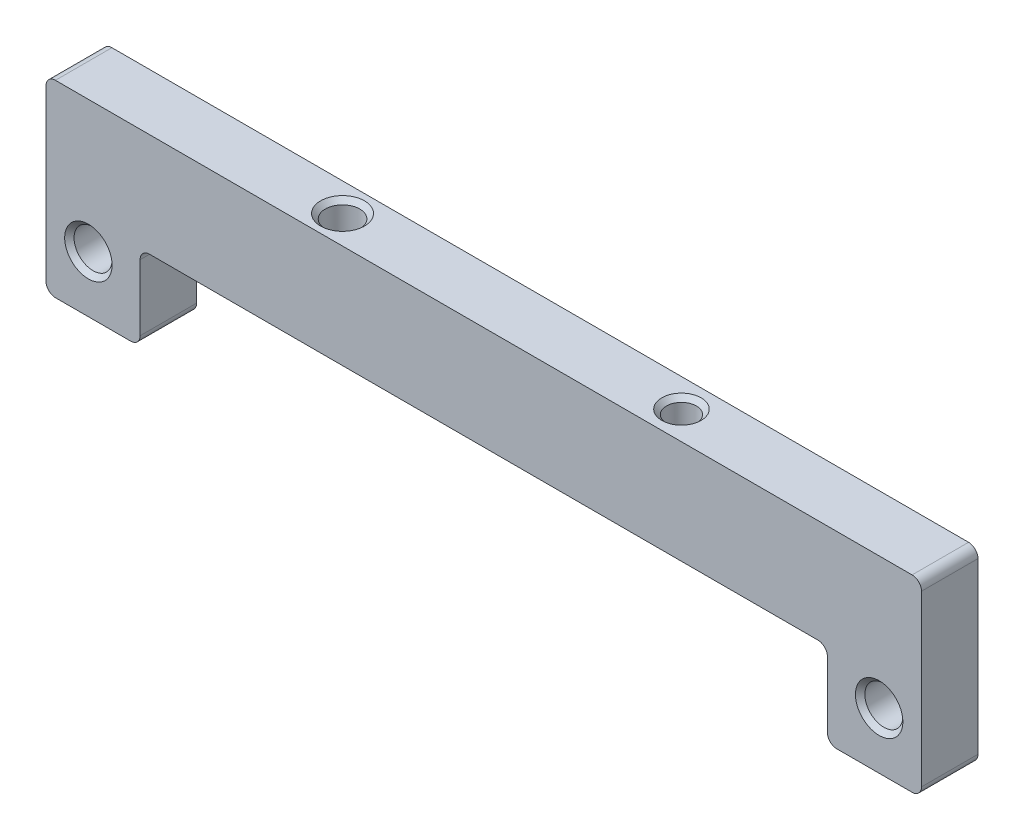
ISO-10303-21;
HEADER;
FILE_DESCRIPTION(('STEP AP214'),'2;1');
FILE_NAME('part.step','',(''),(''),'','','');
FILE_SCHEMA(('AUTOMOTIVE_DESIGN { 1 0 10303 214 1 1 1 1 }'));
ENDSEC;
DATA;
#1=APPLICATION_CONTEXT('core data for automotive mechanical design processes');
#2=APPLICATION_PROTOCOL_DEFINITION('international standard','automotive_design',2000,#1);
#3=PRODUCT_CONTEXT('',#1,'mechanical');
#4=PRODUCT('Part','Part','',(#3));
#5=PRODUCT_RELATED_PRODUCT_CATEGORY('part','',(#4));
#6=PRODUCT_DEFINITION_FORMATION('','',#4);
#7=PRODUCT_DEFINITION_CONTEXT('part definition',#1,'design');
#8=PRODUCT_DEFINITION('design','',#6,#7);
#9=PRODUCT_DEFINITION_SHAPE('','',#8);
#10=(LENGTH_UNIT() NAMED_UNIT(*) SI_UNIT(.MILLI.,.METRE.));
#11=(NAMED_UNIT(*) PLANE_ANGLE_UNIT() SI_UNIT($,.RADIAN.));
#12=(NAMED_UNIT(*) SI_UNIT($,.STERADIAN.) SOLID_ANGLE_UNIT());
#13=UNCERTAINTY_MEASURE_WITH_UNIT(LENGTH_MEASURE(1.E-05),#10,'distance_accuracy_value','');
#14=(GEOMETRIC_REPRESENTATION_CONTEXT(3) GLOBAL_UNCERTAINTY_ASSIGNED_CONTEXT((#13)) GLOBAL_UNIT_ASSIGNED_CONTEXT((#10,
#11,#12)) REPRESENTATION_CONTEXT('',''));
#15=CARTESIAN_POINT('',(0.,0.,0.));
#16=DIRECTION('',(0.,0.,1.));
#17=DIRECTION('',(1.,0.,0.));
#18=AXIS2_PLACEMENT_3D('',#15,#16,#17);
#19=CARTESIAN_POINT('',(-46.5,-10.,6.));
#20=DIRECTION('',(0.,1.,0.));
#21=DIRECTION('',(0.,0.,1.));
#22=AXIS2_PLACEMENT_3D('',#19,#20,#21);
#23=PLANE('',#22);
#24=DIRECTION('',(1.,0.,0.));
#25=VECTOR('',#24,1.);
#26=CARTESIAN_POINT('',(-46.5,-10.,6.));
#27=LINE('',#26,#25);
#28=CARTESIAN_POINT('',(-45.5,-10.,6.));
#29=VERTEX_POINT('',#28);
#30=CARTESIAN_POINT('',(-37.5,-10.,6.));
#31=VERTEX_POINT('',#30);
#32=EDGE_CURVE('E175',#29,#31,#27,.T.);
#33=ORIENTED_EDGE('',*,*,#32,.F.);
#34=DIRECTION('',(0.,0.,-1.));
#35=VECTOR('',#34,1.);
#36=CARTESIAN_POINT('',(-45.5,-10.,6.));
#37=LINE('',#36,#35);
#38=CARTESIAN_POINT('',(-45.5,-10.,0.));
#39=VERTEX_POINT('',#38);
#40=EDGE_CURVE('E158',#29,#39,#37,.T.);
#41=ORIENTED_EDGE('',*,*,#40,.T.);
#42=DIRECTION('',(1.,0.,0.));
#43=VECTOR('',#42,1.);
#44=CARTESIAN_POINT('',(-46.5,-10.,0.));
#45=LINE('',#44,#43);
#46=CARTESIAN_POINT('',(-37.5,-10.,0.));
#47=VERTEX_POINT('',#46);
#48=EDGE_CURVE('E172',#39,#47,#45,.T.);
#49=ORIENTED_EDGE('',*,*,#48,.T.);
#50=DIRECTION('',(0.,0.,1.));
#51=VECTOR('',#50,1.);
#52=CARTESIAN_POINT('',(-37.5,-10.,6.));
#53=LINE('',#52,#51);
#54=EDGE_CURVE('E178',#47,#31,#53,.T.);
#55=ORIENTED_EDGE('',*,*,#54,.T.);
#56=EDGE_LOOP('',(#33,#41,#49,#55));
#57=FACE_BOUND('',#56,.T.);
#58=ADVANCED_FACE('F38',(#57),#23,.F.);
#59=CARTESIAN_POINT('',(46.5,-10.,6.));
#60=DIRECTION('',(-1.,0.,0.));
#61=DIRECTION('',(0.,0.,1.));
#62=AXIS2_PLACEMENT_3D('',#59,#60,#61);
#63=PLANE('',#62);
#64=DIRECTION('',(0.,1.,0.));
#65=VECTOR('',#64,1.);
#66=CARTESIAN_POINT('',(46.5,-10.,6.));
#67=LINE('',#66,#65);
#68=CARTESIAN_POINT('',(46.5,-9.,6.));
#69=VERTEX_POINT('',#68);
#70=CARTESIAN_POINT('',(46.5,9.,6.));
#71=VERTEX_POINT('',#70);
#72=EDGE_CURVE('E185',#69,#71,#67,.T.);
#73=ORIENTED_EDGE('',*,*,#72,.F.);
#74=DIRECTION('',(0.,0.,-1.));
#75=VECTOR('',#74,1.);
#76=CARTESIAN_POINT('',(46.5,-9.,6.));
#77=LINE('',#76,#75);
#78=CARTESIAN_POINT('',(46.5,-9.,0.));
#79=VERTEX_POINT('',#78);
#80=EDGE_CURVE('E242',#69,#79,#77,.T.);
#81=ORIENTED_EDGE('',*,*,#80,.T.);
#82=DIRECTION('',(0.,1.,0.));
#83=VECTOR('',#82,1.);
#84=CARTESIAN_POINT('',(46.5,-10.,0.));
#85=LINE('',#84,#83);
#86=CARTESIAN_POINT('',(46.5,9.,0.));
#87=VERTEX_POINT('',#86);
#88=EDGE_CURVE('E361',#79,#87,#85,.T.);
#89=ORIENTED_EDGE('',*,*,#88,.T.);
#90=DIRECTION('',(0.,0.,-1.));
#91=VECTOR('',#90,1.);
#92=CARTESIAN_POINT('',(46.5,9.,6.));
#93=LINE('',#92,#91);
#94=EDGE_CURVE('E239',#87,#71,#93,.F.);
#95=ORIENTED_EDGE('',*,*,#94,.T.);
#96=EDGE_LOOP('',(#73,#81,#89,#95));
#97=FACE_BOUND('',#96,.T.);
#98=ADVANCED_FACE('F354',(#97),#63,.F.);
#99=CARTESIAN_POINT('',(-46.5,10.,6.));
#100=DIRECTION('',(0.,-1.,0.));
#101=DIRECTION('',(0.,0.,-1.));
#102=AXIS2_PLACEMENT_3D('',#99,#100,#101);
#103=PLANE('',#102);
#104=CARTESIAN_POINT('',(-18.,10.,3.));
#105=DIRECTION('',(0.,-1.,0.));
#106=DIRECTION('',(0.,0.,-1.));
#107=AXIS2_PLACEMENT_3D('',#104,#105,#106);
#108=CIRCLE('',#107,2.32880000000001);
#109=CARTESIAN_POINT('',(-18.,10.,0.671199999999993));
#110=VERTEX_POINT('',#109);
#111=EDGE_CURVE('E337',#110,#110,#108,.T.);
#112=ORIENTED_EDGE('',*,*,#111,.T.);
#113=EDGE_LOOP('',(#112));
#114=FACE_BOUND('',#113,.T.);
#115=CARTESIAN_POINT('',(18.,10.,3.));
#116=DIRECTION('',(0.,-1.,0.));
#117=DIRECTION('',(0.,0.,-1.));
#118=AXIS2_PLACEMENT_3D('',#115,#116,#117);
#119=CIRCLE('',#118,2.08749999999999);
#120=CARTESIAN_POINT('',(18.,10.,0.912500000000007));
#121=VERTEX_POINT('',#120);
#122=EDGE_CURVE('E333',#121,#121,#119,.T.);
#123=ORIENTED_EDGE('',*,*,#122,.T.);
#124=EDGE_LOOP('',(#123));
#125=FACE_BOUND('',#124,.T.);
#126=DIRECTION('',(-1.,0.,0.));
#127=VECTOR('',#126,1.);
#128=CARTESIAN_POINT('',(-46.5,10.,0.));
#129=LINE('',#128,#127);
#130=CARTESIAN_POINT('',(45.5,10.,0.));
#131=VERTEX_POINT('',#130);
#132=CARTESIAN_POINT('',(-45.5,10.,0.));
#133=VERTEX_POINT('',#132);
#134=EDGE_CURVE('E358',#131,#133,#129,.T.);
#135=ORIENTED_EDGE('',*,*,#134,.T.);
#136=DIRECTION('',(0.,0.,-1.));
#137=VECTOR('',#136,1.);
#138=CARTESIAN_POINT('',(-45.5,10.,6.));
#139=LINE('',#138,#137);
#140=CARTESIAN_POINT('',(-45.5,10.,6.));
#141=VERTEX_POINT('',#140);
#142=EDGE_CURVE('E54',#133,#141,#139,.F.);
#143=ORIENTED_EDGE('',*,*,#142,.T.);
#144=DIRECTION('',(-1.,0.,0.));
#145=VECTOR('',#144,1.);
#146=CARTESIAN_POINT('',(-46.5,10.,6.));
#147=LINE('',#146,#145);
#148=CARTESIAN_POINT('',(45.5,10.,6.));
#149=VERTEX_POINT('',#148);
#150=EDGE_CURVE('E190',#149,#141,#147,.T.);
#151=ORIENTED_EDGE('',*,*,#150,.F.);
#152=DIRECTION('',(0.,0.,-1.));
#153=VECTOR('',#152,1.);
#154=CARTESIAN_POINT('',(45.5,10.,6.));
#155=LINE('',#154,#153);
#156=EDGE_CURVE('E233',#149,#131,#155,.T.);
#157=ORIENTED_EDGE('',*,*,#156,.T.);
#158=EDGE_LOOP('',(#135,#143,#151,#157));
#159=FACE_BOUND('',#158,.T.);
#160=ADVANCED_FACE('F351',(#114,#125,#159),#103,.F.);
#161=CARTESIAN_POINT('',(-46.5,-10.,6.));
#162=DIRECTION('',(1.,0.,0.));
#163=DIRECTION('',(0.,0.,-1.));
#164=AXIS2_PLACEMENT_3D('',#161,#162,#163);
#165=PLANE('',#164);
#166=DIRECTION('',(0.,-1.,0.));
#167=VECTOR('',#166,1.);
#168=CARTESIAN_POINT('',(-46.5,-10.,0.));
#169=LINE('',#168,#167);
#170=CARTESIAN_POINT('',(-46.5,9.,0.));
#171=VERTEX_POINT('',#170);
#172=CARTESIAN_POINT('',(-46.5,-9.,0.));
#173=VERTEX_POINT('',#172);
#174=EDGE_CURVE('E193',#171,#173,#169,.T.);
#175=ORIENTED_EDGE('',*,*,#174,.T.);
#176=DIRECTION('',(0.,0.,-1.));
#177=VECTOR('',#176,1.);
#178=CARTESIAN_POINT('',(-46.5,-9.,6.));
#179=LINE('',#178,#177);
#180=CARTESIAN_POINT('',(-46.5,-9.,6.));
#181=VERTEX_POINT('',#180);
#182=EDGE_CURVE('E159',#173,#181,#179,.F.);
#183=ORIENTED_EDGE('',*,*,#182,.T.);
#184=DIRECTION('',(0.,-1.,0.));
#185=VECTOR('',#184,1.);
#186=CARTESIAN_POINT('',(-46.5,-10.,6.));
#187=LINE('',#186,#185);
#188=CARTESIAN_POINT('',(-46.5,9.,6.));
#189=VERTEX_POINT('',#188);
#190=EDGE_CURVE('E369',#189,#181,#187,.T.);
#191=ORIENTED_EDGE('',*,*,#190,.F.);
#192=DIRECTION('',(0.,0.,-1.));
#193=VECTOR('',#192,1.);
#194=CARTESIAN_POINT('',(-46.5,9.,6.));
#195=LINE('',#194,#193);
#196=EDGE_CURVE('E165',#189,#171,#195,.T.);
#197=ORIENTED_EDGE('',*,*,#196,.T.);
#198=EDGE_LOOP('',(#175,#183,#191,#197));
#199=FACE_BOUND('',#198,.T.);
#200=ADVANCED_FACE('F353',(#199),#165,.F.);
#201=CARTESIAN_POINT('',(37.5,-10.,0.));
#202=VERTEX_POINT('',#201);
#203=CARTESIAN_POINT('',(45.5,-10.,0.));
#204=VERTEX_POINT('',#203);
#205=EDGE_CURVE('E186',#202,#204,#45,.T.);
#206=ORIENTED_EDGE('',*,*,#205,.T.);
#207=DIRECTION('',(0.,0.,-1.));
#208=VECTOR('',#207,1.);
#209=CARTESIAN_POINT('',(45.5,-10.,6.));
#210=LINE('',#209,#208);
#211=CARTESIAN_POINT('',(45.5,-10.,6.));
#212=VERTEX_POINT('',#211);
#213=EDGE_CURVE('E249',#204,#212,#210,.F.);
#214=ORIENTED_EDGE('',*,*,#213,.T.);
#215=CARTESIAN_POINT('',(37.5,-10.,6.));
#216=VERTEX_POINT('',#215);
#217=EDGE_CURVE('E372',#216,#212,#27,.T.);
#218=ORIENTED_EDGE('',*,*,#217,.F.);
#219=DIRECTION('',(0.,0.,1.));
#220=VECTOR('',#219,1.);
#221=CARTESIAN_POINT('',(37.5,-10.,6.));
#222=LINE('',#221,#220);
#223=EDGE_CURVE('E246',#216,#202,#222,.F.);
#224=ORIENTED_EDGE('',*,*,#223,.T.);
#225=EDGE_LOOP('',(#206,#214,#218,#224));
#226=FACE_BOUND('',#225,.T.);
#227=ADVANCED_FACE('F449',(#226),#23,.F.);
#228=CARTESIAN_POINT('',(0.,0.,6.));
#229=DIRECTION('',(0.,0.,-1.));
#230=DIRECTION('',(-1.,0.,0.));
#231=AXIS2_PLACEMENT_3D('',#228,#229,#230);
#232=PLANE('',#231);
#233=CARTESIAN_POINT('',(42.,-3.99999999999999,6.));
#234=DIRECTION('',(0.,0.,-1.));
#235=DIRECTION('',(-1.,0.,0.));
#236=AXIS2_PLACEMENT_3D('',#233,#234,#235);
#237=CIRCLE('',#236,2.51930000000004);
#238=CARTESIAN_POINT('',(39.4807,-3.99999999999999,6.));
#239=VERTEX_POINT('',#238);
#240=EDGE_CURVE('E297',#239,#239,#237,.T.);
#241=ORIENTED_EDGE('',*,*,#240,.T.);
#242=EDGE_LOOP('',(#241));
#243=FACE_BOUND('',#242,.T.);
#244=CARTESIAN_POINT('',(-42.,-4.,6.));
#245=DIRECTION('',(0.,0.,-1.));
#246=DIRECTION('',(-1.,0.,0.));
#247=AXIS2_PLACEMENT_3D('',#244,#245,#246);
#248=CIRCLE('',#247,2.51930000000002);
#249=CARTESIAN_POINT('',(-44.5193,-4.,6.));
#250=VERTEX_POINT('',#249);
#251=EDGE_CURVE('E293',#250,#250,#248,.T.);
#252=ORIENTED_EDGE('',*,*,#251,.T.);
#253=EDGE_LOOP('',(#252));
#254=FACE_BOUND('',#253,.T.);
#255=ORIENTED_EDGE('',*,*,#190,.T.);
#256=CARTESIAN_POINT('',(-45.5,-9.,6.));
#257=DIRECTION('',(0.,0.,-1.));
#258=DIRECTION('',(-1.,0.,0.));
#259=AXIS2_PLACEMENT_3D('',#256,#257,#258);
#260=CIRCLE('',#259,1.);
#261=EDGE_CURVE('E230',#181,#29,#260,.F.);
#262=ORIENTED_EDGE('',*,*,#261,.T.);
#263=ORIENTED_EDGE('',*,*,#32,.T.);
#264=CARTESIAN_POINT('',(-37.5,-9.,6.));
#265=DIRECTION('',(0.,0.,-1.));
#266=DIRECTION('',(-1.,0.,0.));
#267=AXIS2_PLACEMENT_3D('',#264,#265,#266);
#268=CIRCLE('',#267,1.);
#269=CARTESIAN_POINT('',(-36.5,-9.,6.));
#270=VERTEX_POINT('',#269);
#271=EDGE_CURVE('E218',#31,#270,#268,.F.);
#272=ORIENTED_EDGE('',*,*,#271,.T.);
#273=DIRECTION('',(0.,-1.,0.));
#274=VECTOR('',#273,1.);
#275=CARTESIAN_POINT('',(-36.5,-10.,6.));
#276=LINE('',#275,#274);
#277=CARTESIAN_POINT('',(-36.5,-2.,6.));
#278=VERTEX_POINT('',#277);
#279=EDGE_CURVE('E395',#278,#270,#276,.T.);
#280=ORIENTED_EDGE('',*,*,#279,.F.);
#281=CARTESIAN_POINT('',(-35.5,-2.,6.));
#282=DIRECTION('',(0.,0.,-1.));
#283=DIRECTION('',(-1.,0.,0.));
#284=AXIS2_PLACEMENT_3D('',#281,#282,#283);
#285=CIRCLE('',#284,1.);
#286=CARTESIAN_POINT('',(-35.5,-1.,6.));
#287=VERTEX_POINT('',#286);
#288=EDGE_CURVE('E279',#278,#287,#285,.T.);
#289=ORIENTED_EDGE('',*,*,#288,.T.);
#290=DIRECTION('',(-1.,0.,0.));
#291=VECTOR('',#290,1.);
#292=CARTESIAN_POINT('',(-36.5,-1.,6.));
#293=LINE('',#292,#291);
#294=CARTESIAN_POINT('',(35.5,-1.,6.));
#295=VERTEX_POINT('',#294);
#296=EDGE_CURVE('E382',#295,#287,#293,.T.);
#297=ORIENTED_EDGE('',*,*,#296,.F.);
#298=CARTESIAN_POINT('',(35.5,-2.,6.));
#299=DIRECTION('',(0.,0.,-1.));
#300=DIRECTION('',(-1.,0.,0.));
#301=AXIS2_PLACEMENT_3D('',#298,#299,#300);
#302=CIRCLE('',#301,1.);
#303=CARTESIAN_POINT('',(36.5,-2.,6.));
#304=VERTEX_POINT('',#303);
#305=EDGE_CURVE('E273',#295,#304,#302,.T.);
#306=ORIENTED_EDGE('',*,*,#305,.T.);
#307=DIRECTION('',(0.,1.,0.));
#308=VECTOR('',#307,1.);
#309=CARTESIAN_POINT('',(36.5,-10.,6.));
#310=LINE('',#309,#308);
#311=CARTESIAN_POINT('',(36.5,-9.,6.));
#312=VERTEX_POINT('',#311);
#313=EDGE_CURVE('E388',#312,#304,#310,.T.);
#314=ORIENTED_EDGE('',*,*,#313,.F.);
#315=CARTESIAN_POINT('',(37.5,-9.,6.));
#316=DIRECTION('',(0.,0.,-1.));
#317=DIRECTION('',(-1.,0.,0.));
#318=AXIS2_PLACEMENT_3D('',#315,#316,#317);
#319=CIRCLE('',#318,1.);
#320=EDGE_CURVE('E221',#312,#216,#319,.F.);
#321=ORIENTED_EDGE('',*,*,#320,.T.);
#322=ORIENTED_EDGE('',*,*,#217,.T.);
#323=CARTESIAN_POINT('',(45.5,-9.,6.));
#324=DIRECTION('',(0.,0.,-1.));
#325=DIRECTION('',(-1.,0.,0.));
#326=AXIS2_PLACEMENT_3D('',#323,#324,#325);
#327=CIRCLE('',#326,1.);
#328=EDGE_CURVE('E224',#212,#69,#327,.F.);
#329=ORIENTED_EDGE('',*,*,#328,.T.);
#330=ORIENTED_EDGE('',*,*,#72,.T.);
#331=CARTESIAN_POINT('',(45.5,9.,6.));
#332=DIRECTION('',(0.,0.,-1.));
#333=DIRECTION('',(-1.,0.,0.));
#334=AXIS2_PLACEMENT_3D('',#331,#332,#333);
#335=CIRCLE('',#334,1.);
#336=EDGE_CURVE('E61',#71,#149,#335,.F.);
#337=ORIENTED_EDGE('',*,*,#336,.T.);
#338=ORIENTED_EDGE('',*,*,#150,.T.);
#339=CARTESIAN_POINT('',(-45.5,9.,6.));
#340=DIRECTION('',(0.,0.,-1.));
#341=DIRECTION('',(-1.,0.,0.));
#342=AXIS2_PLACEMENT_3D('',#339,#340,#341);
#343=CIRCLE('',#342,1.);
#344=EDGE_CURVE('E227',#141,#189,#343,.F.);
#345=ORIENTED_EDGE('',*,*,#344,.T.);
#346=EDGE_LOOP('',(#255,#262,#263,#272,#280,#289,#297,#306,#314,#321,#322,#329,#330,#337,#338,#345));
#347=FACE_BOUND('',#346,.T.);
#348=ADVANCED_FACE('F368',(#243,#254,#347),#232,.F.);
#349=CARTESIAN_POINT('',(0.,0.,0.));
#350=DIRECTION('',(0.,0.,-1.));
#351=DIRECTION('',(-1.,0.,0.));
#352=AXIS2_PLACEMENT_3D('',#349,#350,#351);
#353=PLANE('',#352);
#354=CARTESIAN_POINT('',(42.,-3.99999999999999,0.));
#355=DIRECTION('',(0.,0.,-1.));
#356=DIRECTION('',(-1.,0.,0.));
#357=AXIS2_PLACEMENT_3D('',#354,#355,#356);
#358=CIRCLE('',#357,2.51930000000001);
#359=CARTESIAN_POINT('',(39.4807,-3.99999999999999,0.));
#360=VERTEX_POINT('',#359);
#361=EDGE_CURVE('E305',#360,#360,#358,.F.);
#362=ORIENTED_EDGE('',*,*,#361,.T.);
#363=EDGE_LOOP('',(#362));
#364=FACE_BOUND('',#363,.T.);
#365=CARTESIAN_POINT('',(-42.,-4.,0.));
#366=DIRECTION('',(0.,0.,-1.));
#367=DIRECTION('',(-1.,0.,0.));
#368=AXIS2_PLACEMENT_3D('',#365,#366,#367);
#369=CIRCLE('',#368,2.51930000000001);
#370=CARTESIAN_POINT('',(-44.5193,-4.,0.));
#371=VERTEX_POINT('',#370);
#372=EDGE_CURVE('E301',#371,#371,#369,.F.);
#373=ORIENTED_EDGE('',*,*,#372,.T.);
#374=EDGE_LOOP('',(#373));
#375=FACE_BOUND('',#374,.T.);
#376=ORIENTED_EDGE('',*,*,#48,.F.);
#377=CARTESIAN_POINT('',(-45.5,-9.,0.));
#378=DIRECTION('',(0.,0.,-1.));
#379=DIRECTION('',(-1.,0.,0.));
#380=AXIS2_PLACEMENT_3D('',#377,#378,#379);
#381=CIRCLE('',#380,1.);
#382=EDGE_CURVE('E154',#39,#173,#381,.T.);
#383=ORIENTED_EDGE('',*,*,#382,.T.);
#384=ORIENTED_EDGE('',*,*,#174,.F.);
#385=CARTESIAN_POINT('',(-45.5,9.,0.));
#386=DIRECTION('',(0.,0.,-1.));
#387=DIRECTION('',(-1.,0.,0.));
#388=AXIS2_PLACEMENT_3D('',#385,#386,#387);
#389=CIRCLE('',#388,1.);
#390=EDGE_CURVE('E166',#171,#133,#389,.T.);
#391=ORIENTED_EDGE('',*,*,#390,.T.);
#392=ORIENTED_EDGE('',*,*,#134,.F.);
#393=CARTESIAN_POINT('',(45.5,9.,0.));
#394=DIRECTION('',(0.,0.,-1.));
#395=DIRECTION('',(-1.,0.,0.));
#396=AXIS2_PLACEMENT_3D('',#393,#394,#395);
#397=CIRCLE('',#396,1.);
#398=EDGE_CURVE('E177',#131,#87,#397,.T.);
#399=ORIENTED_EDGE('',*,*,#398,.T.);
#400=ORIENTED_EDGE('',*,*,#88,.F.);
#401=CARTESIAN_POINT('',(45.5,-9.,0.));
#402=DIRECTION('',(0.,0.,-1.));
#403=DIRECTION('',(-1.,0.,0.));
#404=AXIS2_PLACEMENT_3D('',#401,#402,#403);
#405=CIRCLE('',#404,1.);
#406=EDGE_CURVE('E206',#79,#204,#405,.T.);
#407=ORIENTED_EDGE('',*,*,#406,.T.);
#408=ORIENTED_EDGE('',*,*,#205,.F.);
#409=CARTESIAN_POINT('',(37.5,-9.,0.));
#410=DIRECTION('',(0.,0.,-1.));
#411=DIRECTION('',(-1.,0.,0.));
#412=AXIS2_PLACEMENT_3D('',#409,#410,#411);
#413=CIRCLE('',#412,1.);
#414=CARTESIAN_POINT('',(36.5,-9.,0.));
#415=VERTEX_POINT('',#414);
#416=EDGE_CURVE('E203',#202,#415,#413,.T.);
#417=ORIENTED_EDGE('',*,*,#416,.T.);
#418=DIRECTION('',(0.,1.,0.));
#419=VECTOR('',#418,1.);
#420=CARTESIAN_POINT('',(36.5,-10.,0.));
#421=LINE('',#420,#419);
#422=CARTESIAN_POINT('',(36.5,-2.,0.));
#423=VERTEX_POINT('',#422);
#424=EDGE_CURVE('E408',#415,#423,#421,.T.);
#425=ORIENTED_EDGE('',*,*,#424,.T.);
#426=CARTESIAN_POINT('',(35.5,-2.,0.));
#427=DIRECTION('',(0.,0.,-1.));
#428=DIRECTION('',(-1.,0.,0.));
#429=AXIS2_PLACEMENT_3D('',#426,#427,#428);
#430=CIRCLE('',#429,1.);
#431=CARTESIAN_POINT('',(35.5,-1.,0.));
#432=VERTEX_POINT('',#431);
#433=EDGE_CURVE('E276',#423,#432,#430,.F.);
#434=ORIENTED_EDGE('',*,*,#433,.T.);
#435=DIRECTION('',(-1.,0.,0.));
#436=VECTOR('',#435,1.);
#437=CARTESIAN_POINT('',(-36.5,-1.,0.));
#438=LINE('',#437,#436);
#439=CARTESIAN_POINT('',(-35.5,-1.,0.));
#440=VERTEX_POINT('',#439);
#441=EDGE_CURVE('E404',#432,#440,#438,.T.);
#442=ORIENTED_EDGE('',*,*,#441,.T.);
#443=CARTESIAN_POINT('',(-35.5,-2.,0.));
#444=DIRECTION('',(0.,0.,-1.));
#445=DIRECTION('',(-1.,0.,0.));
#446=AXIS2_PLACEMENT_3D('',#443,#444,#445);
#447=CIRCLE('',#446,1.);
#448=CARTESIAN_POINT('',(-36.5,-2.,0.));
#449=VERTEX_POINT('',#448);
#450=EDGE_CURVE('E282',#440,#449,#447,.F.);
#451=ORIENTED_EDGE('',*,*,#450,.T.);
#452=DIRECTION('',(0.,-1.,0.));
#453=VECTOR('',#452,1.);
#454=CARTESIAN_POINT('',(-36.5,-10.,0.));
#455=LINE('',#454,#453);
#456=CARTESIAN_POINT('',(-36.5,-9.,0.));
#457=VERTEX_POINT('',#456);
#458=EDGE_CURVE('E401',#449,#457,#455,.T.);
#459=ORIENTED_EDGE('',*,*,#458,.T.);
#460=CARTESIAN_POINT('',(-37.5,-9.,0.));
#461=DIRECTION('',(0.,0.,-1.));
#462=DIRECTION('',(-1.,0.,0.));
#463=AXIS2_PLACEMENT_3D('',#460,#461,#462);
#464=CIRCLE('',#463,1.);
#465=EDGE_CURVE('E183',#457,#47,#464,.T.);
#466=ORIENTED_EDGE('',*,*,#465,.T.);
#467=EDGE_LOOP('',(#376,#383,#384,#391,#392,#399,#400,#407,#408,#417,#425,#434,#442,#451,#459,#466));
#468=FACE_BOUND('',#467,.T.);
#469=ADVANCED_FACE('F180',(#364,#375,#468),#353,.T.);
#470=CARTESIAN_POINT('',(-36.5,-10.,-0.00100000000000013));
#471=DIRECTION('',(-1.,0.,0.));
#472=DIRECTION('',(0.,-1.,0.));
#473=AXIS2_PLACEMENT_3D('',#470,#471,#472);
#474=PLANE('',#473);
#475=ORIENTED_EDGE('',*,*,#458,.F.);
#476=DIRECTION('',(0.,0.,1.));
#477=VECTOR('',#476,1.);
#478=CARTESIAN_POINT('',(-36.5,-2.,6.));
#479=LINE('',#478,#477);
#480=EDGE_CURVE('E269',#449,#278,#479,.T.);
#481=ORIENTED_EDGE('',*,*,#480,.T.);
#482=ORIENTED_EDGE('',*,*,#279,.T.);
#483=DIRECTION('',(0.,0.,1.));
#484=VECTOR('',#483,1.);
#485=CARTESIAN_POINT('',(-36.5,-9.,-0.00100000000000013));
#486=LINE('',#485,#484);
#487=EDGE_CURVE('E266',#270,#457,#486,.F.);
#488=ORIENTED_EDGE('',*,*,#487,.T.);
#489=EDGE_LOOP('',(#475,#481,#482,#488));
#490=FACE_BOUND('',#489,.T.);
#491=ADVANCED_FACE('F431',(#490),#474,.F.);
#492=CARTESIAN_POINT('',(-36.5,-1.,-0.00100000000000013));
#493=DIRECTION('',(0.,1.,0.));
#494=DIRECTION('',(0.,0.,1.));
#495=AXIS2_PLACEMENT_3D('',#492,#493,#494);
#496=PLANE('',#495);
#497=CARTESIAN_POINT('',(-18.,-1.,3.));
#498=DIRECTION('',(0.,1.,0.));
#499=DIRECTION('',(0.,0.,1.));
#500=AXIS2_PLACEMENT_3D('',#497,#498,#499);
#501=CIRCLE('',#500,2.32879999999999);
#502=CARTESIAN_POINT('',(-18.,-1.,5.32879999999999));
#503=VERTEX_POINT('',#502);
#504=EDGE_CURVE('E329',#503,#503,#501,.T.);
#505=ORIENTED_EDGE('',*,*,#504,.T.);
#506=EDGE_LOOP('',(#505));
#507=FACE_BOUND('',#506,.T.);
#508=CARTESIAN_POINT('',(18.,-1.,3.));
#509=DIRECTION('',(0.,1.,0.));
#510=DIRECTION('',(0.,0.,1.));
#511=AXIS2_PLACEMENT_3D('',#508,#509,#510);
#512=CIRCLE('',#511,2.08750000000001);
#513=CARTESIAN_POINT('',(18.,-1.,5.0875));
#514=VERTEX_POINT('',#513);
#515=EDGE_CURVE('E325',#514,#514,#512,.T.);
#516=ORIENTED_EDGE('',*,*,#515,.T.);
#517=EDGE_LOOP('',(#516));
#518=FACE_BOUND('',#517,.T.);
#519=ORIENTED_EDGE('',*,*,#441,.F.);
#520=DIRECTION('',(0.,0.,1.));
#521=VECTOR('',#520,1.);
#522=CARTESIAN_POINT('',(35.5,-1.,6.));
#523=LINE('',#522,#521);
#524=EDGE_CURVE('E262',#432,#295,#523,.T.);
#525=ORIENTED_EDGE('',*,*,#524,.T.);
#526=ORIENTED_EDGE('',*,*,#296,.T.);
#527=DIRECTION('',(0.,0.,1.));
#528=VECTOR('',#527,1.);
#529=CARTESIAN_POINT('',(-35.5,-1.,0.));
#530=LINE('',#529,#528);
#531=EDGE_CURVE('E259',#287,#440,#530,.F.);
#532=ORIENTED_EDGE('',*,*,#531,.T.);
#533=EDGE_LOOP('',(#519,#525,#526,#532));
#534=FACE_BOUND('',#533,.T.);
#535=ADVANCED_FACE('F422',(#507,#518,#534),#496,.F.);
#536=CARTESIAN_POINT('',(36.5,-10.,-0.00100000000000013));
#537=DIRECTION('',(1.,0.,0.));
#538=DIRECTION('',(0.,1.,0.));
#539=AXIS2_PLACEMENT_3D('',#536,#537,#538);
#540=PLANE('',#539);
#541=ORIENTED_EDGE('',*,*,#424,.F.);
#542=DIRECTION('',(0.,0.,1.));
#543=VECTOR('',#542,1.);
#544=CARTESIAN_POINT('',(36.5,-9.,-0.00100000000000013));
#545=LINE('',#544,#543);
#546=EDGE_CURVE('E255',#415,#312,#545,.T.);
#547=ORIENTED_EDGE('',*,*,#546,.T.);
#548=ORIENTED_EDGE('',*,*,#313,.T.);
#549=DIRECTION('',(0.,0.,1.));
#550=VECTOR('',#549,1.);
#551=CARTESIAN_POINT('',(36.5,-2.,0.));
#552=LINE('',#551,#550);
#553=EDGE_CURVE('E252',#304,#423,#552,.F.);
#554=ORIENTED_EDGE('',*,*,#553,.T.);
#555=EDGE_LOOP('',(#541,#547,#548,#554));
#556=FACE_BOUND('',#555,.T.);
#557=ADVANCED_FACE('F475',(#556),#540,.F.);
#558=CARTESIAN_POINT('',(-18.,-1.,3.));
#559=DIRECTION('',(0.,-1.,0.));
#560=DIRECTION('',(0.,0.,-1.));
#561=AXIS2_PLACEMENT_3D('',#558,#559,#560);
#562=CYLINDRICAL_SURFACE('',#561,1.8288);
#563=CARTESIAN_POINT('',(-18.,-0.500000000000015,3.));
#564=DIRECTION('',(0.,1.,0.));
#565=DIRECTION('',(0.,0.,1.));
#566=AXIS2_PLACEMENT_3D('',#563,#564,#565);
#567=CIRCLE('',#566,1.8288);
#568=CARTESIAN_POINT('',(-18.,-0.500000000000015,4.8288));
#569=VERTEX_POINT('',#568);
#570=EDGE_CURVE('E321',#569,#569,#567,.F.);
#571=ORIENTED_EDGE('',*,*,#570,.T.);
#572=EDGE_LOOP('',(#571));
#573=FACE_BOUND('',#572,.T.);
#574=CARTESIAN_POINT('',(-18.,9.5,3.));
#575=DIRECTION('',(0.,-1.,0.));
#576=DIRECTION('',(0.,0.,-1.));
#577=AXIS2_PLACEMENT_3D('',#574,#575,#576);
#578=CIRCLE('',#577,1.8288);
#579=CARTESIAN_POINT('',(-18.,9.5,1.1712));
#580=VERTEX_POINT('',#579);
#581=EDGE_CURVE('E317',#580,#580,#578,.F.);
#582=ORIENTED_EDGE('',*,*,#581,.T.);
#583=EDGE_LOOP('',(#582));
#584=FACE_BOUND('',#583,.T.);
#585=ADVANCED_FACE('F477',(#573,#584),#562,.F.);
#586=CARTESIAN_POINT('',(42.,-3.99999999999999,6.));
#587=DIRECTION('',(0.,0.,1.));
#588=DIRECTION('',(1.,0.,0.));
#589=AXIS2_PLACEMENT_3D('',#586,#587,#588);
#590=CYLINDRICAL_SURFACE('',#589,2.0193);
#591=CARTESIAN_POINT('',(42.,-3.99999999999999,5.49999999999996));
#592=DIRECTION('',(0.,0.,-1.));
#593=DIRECTION('',(-1.,0.,0.));
#594=AXIS2_PLACEMENT_3D('',#591,#592,#593);
#595=CIRCLE('',#594,2.0193);
#596=CARTESIAN_POINT('',(39.9807,-3.99999999999999,5.49999999999996));
#597=VERTEX_POINT('',#596);
#598=EDGE_CURVE('E289',#597,#597,#595,.F.);
#599=ORIENTED_EDGE('',*,*,#598,.T.);
#600=EDGE_LOOP('',(#599));
#601=FACE_BOUND('',#600,.T.);
#602=CARTESIAN_POINT('',(42.,-3.99999999999999,0.500000000000011));
#603=DIRECTION('',(0.,0.,-1.));
#604=DIRECTION('',(-1.,0.,0.));
#605=AXIS2_PLACEMENT_3D('',#602,#603,#604);
#606=CIRCLE('',#605,2.0193);
#607=CARTESIAN_POINT('',(39.9807,-3.99999999999999,0.500000000000011));
#608=VERTEX_POINT('',#607);
#609=EDGE_CURVE('E285',#608,#608,#606,.T.);
#610=ORIENTED_EDGE('',*,*,#609,.T.);
#611=EDGE_LOOP('',(#610));
#612=FACE_BOUND('',#611,.T.);
#613=ADVANCED_FACE('F483',(#601,#612),#590,.F.);
#614=CARTESIAN_POINT('',(-42.,-4.,6.));
#615=DIRECTION('',(0.,0.,1.));
#616=DIRECTION('',(1.,0.,0.));
#617=AXIS2_PLACEMENT_3D('',#614,#615,#616);
#618=CYLINDRICAL_SURFACE('',#617,2.0193);
#619=CARTESIAN_POINT('',(-42.,-4.,5.49999999999996));
#620=DIRECTION('',(0.,0.,-1.));
#621=DIRECTION('',(-1.,0.,0.));
#622=AXIS2_PLACEMENT_3D('',#619,#620,#621);
#623=CIRCLE('',#622,2.0193);
#624=CARTESIAN_POINT('',(-44.0193,-4.,5.49999999999996));
#625=VERTEX_POINT('',#624);
#626=EDGE_CURVE('E313',#625,#625,#623,.F.);
#627=ORIENTED_EDGE('',*,*,#626,.T.);
#628=EDGE_LOOP('',(#627));
#629=FACE_BOUND('',#628,.T.);
#630=CARTESIAN_POINT('',(-42.,-4.,0.500000000000011));
#631=DIRECTION('',(0.,0.,-1.));
#632=DIRECTION('',(-1.,0.,0.));
#633=AXIS2_PLACEMENT_3D('',#630,#631,#632);
#634=CIRCLE('',#633,2.0193);
#635=CARTESIAN_POINT('',(-44.0193,-4.,0.500000000000011));
#636=VERTEX_POINT('',#635);
#637=EDGE_CURVE('E309',#636,#636,#634,.T.);
#638=ORIENTED_EDGE('',*,*,#637,.T.);
#639=EDGE_LOOP('',(#638));
#640=FACE_BOUND('',#639,.T.);
#641=ADVANCED_FACE('F528',(#629,#640),#618,.F.);
#642=CARTESIAN_POINT('',(18.,-1.,3.));
#643=DIRECTION('',(0.,-1.,0.));
#644=DIRECTION('',(0.,0.,-1.));
#645=AXIS2_PLACEMENT_3D('',#642,#643,#644);
#646=CYLINDRICAL_SURFACE('',#645,1.5875);
#647=CARTESIAN_POINT('',(18.,-0.500000000000001,3.));
#648=DIRECTION('',(0.,1.,0.));
#649=DIRECTION('',(0.,0.,1.));
#650=AXIS2_PLACEMENT_3D('',#647,#648,#649);
#651=CIRCLE('',#650,1.5875);
#652=CARTESIAN_POINT('',(18.,-0.500000000000001,4.5875));
#653=VERTEX_POINT('',#652);
#654=EDGE_CURVE('E11',#653,#653,#651,.F.);
#655=ORIENTED_EDGE('',*,*,#654,.T.);
#656=EDGE_LOOP('',(#655));
#657=FACE_BOUND('',#656,.T.);
#658=CARTESIAN_POINT('',(18.,9.5,3.));
#659=DIRECTION('',(0.,-1.,0.));
#660=DIRECTION('',(0.,0.,-1.));
#661=AXIS2_PLACEMENT_3D('',#658,#659,#660);
#662=CIRCLE('',#661,1.5875);
#663=CARTESIAN_POINT('',(18.,9.5,1.4125));
#664=VERTEX_POINT('',#663);
#665=EDGE_CURVE('E47',#664,#664,#662,.F.);
#666=ORIENTED_EDGE('',*,*,#665,.T.);
#667=EDGE_LOOP('',(#666));
#668=FACE_BOUND('',#667,.T.);
#669=ADVANCED_FACE('F344',(#657,#668),#646,.F.);
#670=CARTESIAN_POINT('',(-45.5,-9.,6.));
#671=DIRECTION('',(0.,0.,-1.));
#672=DIRECTION('',(-1.,0.,0.));
#673=AXIS2_PLACEMENT_3D('',#670,#671,#672);
#674=CYLINDRICAL_SURFACE('',#673,1.);
#675=ORIENTED_EDGE('',*,*,#261,.F.);
#676=ORIENTED_EDGE('',*,*,#182,.F.);
#677=ORIENTED_EDGE('',*,*,#382,.F.);
#678=ORIENTED_EDGE('',*,*,#40,.F.);
#679=EDGE_LOOP('',(#675,#676,#677,#678));
#680=FACE_BOUND('',#679,.T.);
#681=ADVANCED_FACE('F157',(#680),#674,.T.);
#682=CARTESIAN_POINT('',(-45.5,9.,6.));
#683=DIRECTION('',(0.,0.,-1.));
#684=DIRECTION('',(-1.,0.,0.));
#685=AXIS2_PLACEMENT_3D('',#682,#683,#684);
#686=CYLINDRICAL_SURFACE('',#685,1.);
#687=ORIENTED_EDGE('',*,*,#344,.F.);
#688=ORIENTED_EDGE('',*,*,#142,.F.);
#689=ORIENTED_EDGE('',*,*,#390,.F.);
#690=ORIENTED_EDGE('',*,*,#196,.F.);
#691=EDGE_LOOP('',(#687,#688,#689,#690));
#692=FACE_BOUND('',#691,.T.);
#693=ADVANCED_FACE('F364',(#692),#686,.T.);
#694=CARTESIAN_POINT('',(45.5,-9.,6.));
#695=DIRECTION('',(0.,0.,-1.));
#696=DIRECTION('',(-1.,0.,0.));
#697=AXIS2_PLACEMENT_3D('',#694,#695,#696);
#698=CYLINDRICAL_SURFACE('',#697,1.);
#699=ORIENTED_EDGE('',*,*,#328,.F.);
#700=ORIENTED_EDGE('',*,*,#213,.F.);
#701=ORIENTED_EDGE('',*,*,#406,.F.);
#702=ORIENTED_EDGE('',*,*,#80,.F.);
#703=EDGE_LOOP('',(#699,#700,#701,#702));
#704=FACE_BOUND('',#703,.T.);
#705=ADVANCED_FACE('F470',(#704),#698,.T.);
#706=CARTESIAN_POINT('',(37.5,-9.,-0.00100000000000013));
#707=DIRECTION('',(0.,0.,1.));
#708=DIRECTION('',(1.,0.,0.));
#709=AXIS2_PLACEMENT_3D('',#706,#707,#708);
#710=CYLINDRICAL_SURFACE('',#709,1.);
#711=ORIENTED_EDGE('',*,*,#416,.F.);
#712=ORIENTED_EDGE('',*,*,#223,.F.);
#713=ORIENTED_EDGE('',*,*,#320,.F.);
#714=ORIENTED_EDGE('',*,*,#546,.F.);
#715=EDGE_LOOP('',(#711,#712,#713,#714));
#716=FACE_BOUND('',#715,.T.);
#717=ADVANCED_FACE('F474',(#716),#710,.T.);
#718=CARTESIAN_POINT('',(35.5,-2.,-0.00100000000000013));
#719=DIRECTION('',(0.,0.,-1.));
#720=DIRECTION('',(-1.,0.,0.));
#721=AXIS2_PLACEMENT_3D('',#718,#719,#720);
#722=CYLINDRICAL_SURFACE('',#721,1.);
#723=ORIENTED_EDGE('',*,*,#433,.F.);
#724=ORIENTED_EDGE('',*,*,#553,.F.);
#725=ORIENTED_EDGE('',*,*,#305,.F.);
#726=ORIENTED_EDGE('',*,*,#524,.F.);
#727=EDGE_LOOP('',(#723,#724,#725,#726));
#728=FACE_BOUND('',#727,.T.);
#729=ADVANCED_FACE('F421',(#728),#722,.F.);
#730=CARTESIAN_POINT('',(-35.5,-2.,-0.00100000000000013));
#731=DIRECTION('',(0.,0.,-1.));
#732=DIRECTION('',(-1.,0.,0.));
#733=AXIS2_PLACEMENT_3D('',#730,#731,#732);
#734=CYLINDRICAL_SURFACE('',#733,1.);
#735=ORIENTED_EDGE('',*,*,#450,.F.);
#736=ORIENTED_EDGE('',*,*,#531,.F.);
#737=ORIENTED_EDGE('',*,*,#288,.F.);
#738=ORIENTED_EDGE('',*,*,#480,.F.);
#739=EDGE_LOOP('',(#735,#736,#737,#738));
#740=FACE_BOUND('',#739,.T.);
#741=ADVANCED_FACE('F428',(#740),#734,.F.);
#742=CARTESIAN_POINT('',(-37.5,-9.,6.));
#743=DIRECTION('',(0.,0.,1.));
#744=DIRECTION('',(1.,0.,0.));
#745=AXIS2_PLACEMENT_3D('',#742,#743,#744);
#746=CYLINDRICAL_SURFACE('',#745,1.);
#747=ORIENTED_EDGE('',*,*,#465,.F.);
#748=ORIENTED_EDGE('',*,*,#487,.F.);
#749=ORIENTED_EDGE('',*,*,#271,.F.);
#750=ORIENTED_EDGE('',*,*,#54,.F.);
#751=EDGE_LOOP('',(#747,#748,#749,#750));
#752=FACE_BOUND('',#751,.T.);
#753=ADVANCED_FACE('F434',(#752),#746,.T.);
#754=CARTESIAN_POINT('',(45.5,9.,6.));
#755=DIRECTION('',(0.,0.,-1.));
#756=DIRECTION('',(-1.,0.,0.));
#757=AXIS2_PLACEMENT_3D('',#754,#755,#756);
#758=CYLINDRICAL_SURFACE('',#757,1.);
#759=ORIENTED_EDGE('',*,*,#336,.F.);
#760=ORIENTED_EDGE('',*,*,#94,.F.);
#761=ORIENTED_EDGE('',*,*,#398,.F.);
#762=ORIENTED_EDGE('',*,*,#156,.F.);
#763=EDGE_LOOP('',(#759,#760,#761,#762));
#764=FACE_BOUND('',#763,.T.);
#765=ADVANCED_FACE('F437',(#764),#758,.T.);
#766=CARTESIAN_POINT('',(42.,-3.99999999999999,5.49999999999996));
#767=DIRECTION('',(0.,0.,1.));
#768=DIRECTION('',(1.,0.,0.));
#769=AXIS2_PLACEMENT_3D('',#766,#767,#768);
#770=CONICAL_SURFACE('',#769,2.0193,0.785398163397448);
#771=ORIENTED_EDGE('',*,*,#240,.F.);
#772=EDGE_LOOP('',(#771));
#773=FACE_BOUND('',#772,.T.);
#774=ORIENTED_EDGE('',*,*,#598,.F.);
#775=EDGE_LOOP('',(#774));
#776=FACE_BOUND('',#775,.T.);
#777=ADVANCED_FACE('F443',(#773,#776),#770,.F.);
#778=CARTESIAN_POINT('',(42.,-3.99999999999999,0.));
#779=DIRECTION('',(0.,0.,-1.));
#780=DIRECTION('',(-1.,0.,0.));
#781=AXIS2_PLACEMENT_3D('',#778,#779,#780);
#782=CONICAL_SURFACE('',#781,2.51930000000001,0.785398163397448);
#783=ORIENTED_EDGE('',*,*,#609,.F.);
#784=EDGE_LOOP('',(#783));
#785=FACE_BOUND('',#784,.T.);
#786=ORIENTED_EDGE('',*,*,#361,.F.);
#787=EDGE_LOOP('',(#786));
#788=FACE_BOUND('',#787,.T.);
#789=ADVANCED_FACE('F511',(#785,#788),#782,.F.);
#790=CARTESIAN_POINT('',(-42.,-4.,5.49999999999996));
#791=DIRECTION('',(0.,0.,1.));
#792=DIRECTION('',(1.,0.,0.));
#793=AXIS2_PLACEMENT_3D('',#790,#791,#792);
#794=CONICAL_SURFACE('',#793,2.0193,0.785398163397434);
#795=ORIENTED_EDGE('',*,*,#251,.F.);
#796=EDGE_LOOP('',(#795));
#797=FACE_BOUND('',#796,.T.);
#798=ORIENTED_EDGE('',*,*,#626,.F.);
#799=EDGE_LOOP('',(#798));
#800=FACE_BOUND('',#799,.T.);
#801=ADVANCED_FACE('F501',(#797,#800),#794,.F.);
#802=CARTESIAN_POINT('',(-42.,-4.,0.));
#803=DIRECTION('',(0.,0.,-1.));
#804=DIRECTION('',(-1.,0.,0.));
#805=AXIS2_PLACEMENT_3D('',#802,#803,#804);
#806=CONICAL_SURFACE('',#805,2.51930000000001,0.785398163397448);
#807=ORIENTED_EDGE('',*,*,#637,.F.);
#808=EDGE_LOOP('',(#807));
#809=FACE_BOUND('',#808,.T.);
#810=ORIENTED_EDGE('',*,*,#372,.F.);
#811=EDGE_LOOP('',(#810));
#812=FACE_BOUND('',#811,.T.);
#813=ADVANCED_FACE('F498',(#809,#812),#806,.F.);
#814=CARTESIAN_POINT('',(-18.,-0.500000000000015,3.));
#815=DIRECTION('',(0.,-1.,0.));
#816=DIRECTION('',(0.,0.,-1.));
#817=AXIS2_PLACEMENT_3D('',#814,#815,#816);
#818=CONICAL_SURFACE('',#817,1.8288,0.785398163397456);
#819=ORIENTED_EDGE('',*,*,#504,.F.);
#820=EDGE_LOOP('',(#819));
#821=FACE_BOUND('',#820,.T.);
#822=ORIENTED_EDGE('',*,*,#570,.F.);
#823=EDGE_LOOP('',(#822));
#824=FACE_BOUND('',#823,.T.);
#825=ADVANCED_FACE('F500',(#821,#824),#818,.F.);
#826=CARTESIAN_POINT('',(-18.,10.,3.));
#827=DIRECTION('',(0.,1.,0.));
#828=DIRECTION('',(0.,0.,1.));
#829=AXIS2_PLACEMENT_3D('',#826,#827,#828);
#830=CONICAL_SURFACE('',#829,2.32880000000001,0.785398163397455);
#831=ORIENTED_EDGE('',*,*,#581,.F.);
#832=EDGE_LOOP('',(#831));
#833=FACE_BOUND('',#832,.T.);
#834=ORIENTED_EDGE('',*,*,#111,.F.);
#835=EDGE_LOOP('',(#834));
#836=FACE_BOUND('',#835,.T.);
#837=ADVANCED_FACE('F508',(#833,#836),#830,.F.);
#838=CARTESIAN_POINT('',(18.,-0.500000000000001,3.));
#839=DIRECTION('',(0.,-1.,0.));
#840=DIRECTION('',(0.,0.,-1.));
#841=AXIS2_PLACEMENT_3D('',#838,#839,#840);
#842=CONICAL_SURFACE('',#841,1.5875,0.785398163397457);
#843=ORIENTED_EDGE('',*,*,#515,.F.);
#844=EDGE_LOOP('',(#843));
#845=FACE_BOUND('',#844,.T.);
#846=ORIENTED_EDGE('',*,*,#654,.F.);
#847=EDGE_LOOP('',(#846));
#848=FACE_BOUND('',#847,.T.);
#849=ADVANCED_FACE('F348',(#845,#848),#842,.F.);
#850=CARTESIAN_POINT('',(18.,10.,3.));
#851=DIRECTION('',(0.,1.,0.));
#852=DIRECTION('',(0.,0.,1.));
#853=AXIS2_PLACEMENT_3D('',#850,#851,#852);
#854=CONICAL_SURFACE('',#853,2.08749999999999,0.78539816339744);
#855=ORIENTED_EDGE('',*,*,#665,.F.);
#856=EDGE_LOOP('',(#855));
#857=FACE_BOUND('',#856,.T.);
#858=ORIENTED_EDGE('',*,*,#122,.F.);
#859=EDGE_LOOP('',(#858));
#860=FACE_BOUND('',#859,.T.);
#861=ADVANCED_FACE('F40',(#857,#860),#854,.F.);
#862=CLOSED_SHELL('',(#58,#98,#160,#200,#227,#348,#469,#491,#535,#557,#585,#613,#641,#669,#681,
#693,#705,#717,#729,#741,#753,#765,#777,#789,#801,#813,#825,#837,#849,#861));
#863=MANIFOLD_SOLID_BREP('B2',#862);
#864=ADVANCED_BREP_SHAPE_REPRESENTATION('',(#18,#863),#14);
#865=SHAPE_DEFINITION_REPRESENTATION(#9,#864);
ENDSEC;
END-ISO-10303-21;
